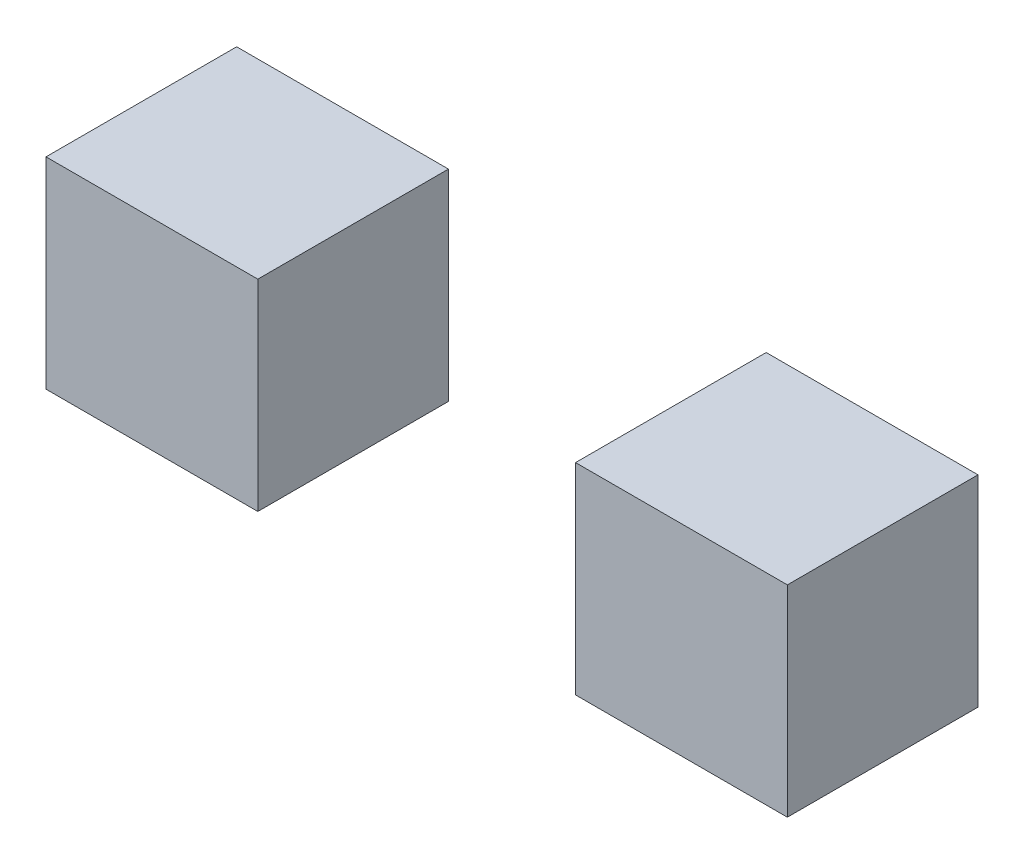
ISO-10303-21;
HEADER;
FILE_DESCRIPTION(('STEP AP214'),'2;1');
FILE_NAME('part.step','',(''),(''),'','','');
FILE_SCHEMA(('AUTOMOTIVE_DESIGN { 1 0 10303 214 1 1 1 1 }'));
ENDSEC;
DATA;
#1=APPLICATION_CONTEXT('core data for automotive mechanical design processes');
#2=APPLICATION_PROTOCOL_DEFINITION('international standard','automotive_design',2000,#1);
#3=PRODUCT_CONTEXT('',#1,'mechanical');
#4=PRODUCT('Part','Part','',(#3));
#5=PRODUCT_RELATED_PRODUCT_CATEGORY('part','',(#4));
#6=PRODUCT_DEFINITION_FORMATION('','',#4);
#7=PRODUCT_DEFINITION_CONTEXT('part definition',#1,'design');
#8=PRODUCT_DEFINITION('design','',#6,#7);
#9=PRODUCT_DEFINITION_SHAPE('','',#8);
#10=(LENGTH_UNIT() NAMED_UNIT(*) SI_UNIT(.MILLI.,.METRE.));
#11=(NAMED_UNIT(*) PLANE_ANGLE_UNIT() SI_UNIT($,.RADIAN.));
#12=(NAMED_UNIT(*) SI_UNIT($,.STERADIAN.) SOLID_ANGLE_UNIT());
#13=UNCERTAINTY_MEASURE_WITH_UNIT(LENGTH_MEASURE(1.E-05),#10,'distance_accuracy_value','');
#14=(GEOMETRIC_REPRESENTATION_CONTEXT(3) GLOBAL_UNCERTAINTY_ASSIGNED_CONTEXT((#13)) GLOBAL_UNIT_ASSIGNED_CONTEXT((#10,
#11,#12)) REPRESENTATION_CONTEXT('',''));
#15=CARTESIAN_POINT('',(0.,0.,0.));
#16=DIRECTION('',(0.,0.,1.));
#17=DIRECTION('',(1.,0.,0.));
#18=AXIS2_PLACEMENT_3D('',#15,#16,#17);
#19=CARTESIAN_POINT('',(0.,0.,9.));
#20=DIRECTION('',(0.,0.,-1.));
#21=DIRECTION('',(-1.,0.,0.));
#22=AXIS2_PLACEMENT_3D('',#19,#20,#21);
#23=PLANE('',#22);
#24=DIRECTION('',(-1.,0.,0.));
#25=VECTOR('',#24,1.);
#26=CARTESIAN_POINT('',(4.75,4.75,9.));
#27=LINE('',#26,#25);
#28=CARTESIAN_POINT('',(20.25,4.75,9.));
#29=VERTEX_POINT('',#28);
#30=CARTESIAN_POINT('',(10.25,4.75000000000001,9.));
#31=VERTEX_POINT('',#30);
#32=EDGE_CURVE('E83',#29,#31,#27,.T.);
#33=ORIENTED_EDGE('',*,*,#32,.T.);
#34=DIRECTION('',(0.,1.,0.));
#35=VECTOR('',#34,1.);
#36=CARTESIAN_POINT('',(10.25,22.115736842558,9.));
#37=LINE('',#36,#35);
#38=CARTESIAN_POINT('',(10.25,-4.74999999999999,9.));
#39=VERTEX_POINT('',#38);
#40=EDGE_CURVE('E53',#39,#31,#37,.T.);
#41=ORIENTED_EDGE('',*,*,#40,.F.);
#42=DIRECTION('',(1.,0.,0.));
#43=VECTOR('',#42,1.);
#44=CARTESIAN_POINT('',(4.75,-4.75,9.));
#45=LINE('',#44,#43);
#46=CARTESIAN_POINT('',(20.25,-4.75,9.));
#47=VERTEX_POINT('',#46);
#48=EDGE_CURVE('E92',#39,#47,#45,.T.);
#49=ORIENTED_EDGE('',*,*,#48,.T.);
#50=DIRECTION('',(0.,1.,0.));
#51=VECTOR('',#50,1.);
#52=CARTESIAN_POINT('',(20.25,-4.75,9.));
#53=LINE('',#52,#51);
#54=EDGE_CURVE('E115',#47,#29,#53,.T.);
#55=ORIENTED_EDGE('',*,*,#54,.T.);
#56=EDGE_LOOP('',(#33,#41,#49,#55));
#57=FACE_BOUND('',#56,.T.);
#58=ADVANCED_FACE('F49',(#57),#23,.F.);
#59=CARTESIAN_POINT('',(0.,0.,0.));
#60=DIRECTION('',(0.,0.,-1.));
#61=DIRECTION('',(-1.,0.,0.));
#62=AXIS2_PLACEMENT_3D('',#59,#60,#61);
#63=PLANE('',#62);
#64=DIRECTION('',(0.,-1.,0.));
#65=VECTOR('',#64,1.);
#66=CARTESIAN_POINT('',(10.25,0.,0.));
#67=LINE('',#66,#65);
#68=CARTESIAN_POINT('',(10.25,4.75,0.));
#69=VERTEX_POINT('',#68);
#70=CARTESIAN_POINT('',(10.25,-4.74999999999999,0.));
#71=VERTEX_POINT('',#70);
#72=EDGE_CURVE('E12',#69,#71,#67,.T.);
#73=ORIENTED_EDGE('',*,*,#72,.F.);
#74=DIRECTION('',(-1.,0.,0.));
#75=VECTOR('',#74,1.);
#76=CARTESIAN_POINT('',(4.75,4.75,0.));
#77=LINE('',#76,#75);
#78=CARTESIAN_POINT('',(20.25,4.75,0.));
#79=VERTEX_POINT('',#78);
#80=EDGE_CURVE('E98',#79,#69,#77,.T.);
#81=ORIENTED_EDGE('',*,*,#80,.F.);
#82=DIRECTION('',(0.,1.,0.));
#83=VECTOR('',#82,1.);
#84=CARTESIAN_POINT('',(20.25,-4.75,0.));
#85=LINE('',#84,#83);
#86=CARTESIAN_POINT('',(20.25,-4.75,0.));
#87=VERTEX_POINT('',#86);
#88=EDGE_CURVE('E101',#87,#79,#85,.T.);
#89=ORIENTED_EDGE('',*,*,#88,.F.);
#90=DIRECTION('',(1.,0.,0.));
#91=VECTOR('',#90,1.);
#92=CARTESIAN_POINT('',(4.75,-4.75,0.));
#93=LINE('',#92,#91);
#94=EDGE_CURVE('E117',#71,#87,#93,.T.);
#95=ORIENTED_EDGE('',*,*,#94,.F.);
#96=EDGE_LOOP('',(#73,#81,#89,#95));
#97=FACE_BOUND('',#96,.T.);
#98=ADVANCED_FACE('F51',(#97),#63,.T.);
#99=CARTESIAN_POINT('',(4.75,-4.75,9.));
#100=DIRECTION('',(0.,1.,0.));
#101=DIRECTION('',(0.,0.,1.));
#102=AXIS2_PLACEMENT_3D('',#99,#100,#101);
#103=PLANE('',#102);
#104=ORIENTED_EDGE('',*,*,#48,.F.);
#105=DIRECTION('',(0.,0.,-1.));
#106=VECTOR('',#105,1.);
#107=CARTESIAN_POINT('',(10.25,-4.75,9.));
#108=LINE('',#107,#106);
#109=EDGE_CURVE('E64',#39,#71,#108,.T.);
#110=ORIENTED_EDGE('',*,*,#109,.T.);
#111=ORIENTED_EDGE('',*,*,#94,.T.);
#112=DIRECTION('',(0.,0.,1.));
#113=VECTOR('',#112,1.);
#114=CARTESIAN_POINT('',(20.25,-4.75,0.));
#115=LINE('',#114,#113);
#116=EDGE_CURVE('E103',#87,#47,#115,.T.);
#117=ORIENTED_EDGE('',*,*,#116,.T.);
#118=EDGE_LOOP('',(#104,#110,#111,#117));
#119=FACE_BOUND('',#118,.T.);
#120=ADVANCED_FACE('F122',(#119),#103,.F.);
#121=CARTESIAN_POINT('',(4.75,4.75,9.));
#122=DIRECTION('',(0.,-1.,0.));
#123=DIRECTION('',(1.,0.,0.));
#124=AXIS2_PLACEMENT_3D('',#121,#122,#123);
#125=PLANE('',#124);
#126=ORIENTED_EDGE('',*,*,#80,.T.);
#127=DIRECTION('',(0.,0.,1.));
#128=VECTOR('',#127,1.);
#129=CARTESIAN_POINT('',(10.25,4.75,9.));
#130=LINE('',#129,#128);
#131=EDGE_CURVE('E102',#69,#31,#130,.T.);
#132=ORIENTED_EDGE('',*,*,#131,.T.);
#133=ORIENTED_EDGE('',*,*,#32,.F.);
#134=DIRECTION('',(0.,0.,1.));
#135=VECTOR('',#134,1.);
#136=CARTESIAN_POINT('',(20.25,4.75,0.));
#137=LINE('',#136,#135);
#138=EDGE_CURVE('E105',#79,#29,#137,.T.);
#139=ORIENTED_EDGE('',*,*,#138,.F.);
#140=EDGE_LOOP('',(#126,#132,#133,#139));
#141=FACE_BOUND('',#140,.T.);
#142=ADVANCED_FACE('F106',(#141),#125,.F.);
#143=CARTESIAN_POINT('',(20.25,-4.75,0.));
#144=DIRECTION('',(1.,0.,0.));
#145=DIRECTION('',(0.,0.,-1.));
#146=AXIS2_PLACEMENT_3D('',#143,#144,#145);
#147=PLANE('',#146);
#148=ORIENTED_EDGE('',*,*,#54,.F.);
#149=ORIENTED_EDGE('',*,*,#116,.F.);
#150=ORIENTED_EDGE('',*,*,#88,.T.);
#151=ORIENTED_EDGE('',*,*,#138,.T.);
#152=EDGE_LOOP('',(#148,#149,#150,#151));
#153=FACE_BOUND('',#152,.T.);
#154=ADVANCED_FACE('F111',(#153),#147,.T.);
#155=CARTESIAN_POINT('',(10.25,22.115736842558,0.));
#156=DIRECTION('',(1.,0.,0.));
#157=DIRECTION('',(0.,0.,-1.));
#158=AXIS2_PLACEMENT_3D('',#155,#156,#157);
#159=PLANE('',#158);
#160=ORIENTED_EDGE('',*,*,#40,.T.);
#161=ORIENTED_EDGE('',*,*,#131,.F.);
#162=ORIENTED_EDGE('',*,*,#72,.T.);
#163=ORIENTED_EDGE('',*,*,#109,.F.);
#164=EDGE_LOOP('',(#160,#161,#162,#163));
#165=FACE_BOUND('',#164,.T.);
#166=ADVANCED_FACE('F134',(#165),#159,.F.);
#167=CLOSED_SHELL('',(#58,#98,#120,#142,#154,#166));
#168=MANIFOLD_SOLID_BREP('B2',#167);
#169=CARTESIAN_POINT('',(-14.75,-4.75,9.));
#170=DIRECTION('',(1.,0.,0.));
#171=DIRECTION('',(0.,0.,-1.));
#172=AXIS2_PLACEMENT_3D('',#169,#170,#171);
#173=PLANE('',#172);
#174=DIRECTION('',(0.,-1.,0.));
#175=VECTOR('',#174,1.);
#176=CARTESIAN_POINT('',(-14.75,-4.75,0.));
#177=LINE('',#176,#175);
#178=CARTESIAN_POINT('',(-14.75,4.75,0.));
#179=VERTEX_POINT('',#178);
#180=CARTESIAN_POINT('',(-14.75,-4.75,0.));
#181=VERTEX_POINT('',#180);
#182=EDGE_CURVE('E216',#179,#181,#177,.T.);
#183=ORIENTED_EDGE('',*,*,#182,.T.);
#184=DIRECTION('',(0.,0.,-1.));
#185=VECTOR('',#184,1.);
#186=CARTESIAN_POINT('',(-14.75,-4.75,9.));
#187=LINE('',#186,#185);
#188=CARTESIAN_POINT('',(-14.75,-4.75,9.));
#189=VERTEX_POINT('',#188);
#190=EDGE_CURVE('E234',#189,#181,#187,.T.);
#191=ORIENTED_EDGE('',*,*,#190,.F.);
#192=DIRECTION('',(0.,-1.,0.));
#193=VECTOR('',#192,1.);
#194=CARTESIAN_POINT('',(-14.75,-4.75,9.));
#195=LINE('',#194,#193);
#196=CARTESIAN_POINT('',(-14.75,4.75,9.));
#197=VERTEX_POINT('',#196);
#198=EDGE_CURVE('E203',#197,#189,#195,.T.);
#199=ORIENTED_EDGE('',*,*,#198,.F.);
#200=DIRECTION('',(0.,0.,-1.));
#201=VECTOR('',#200,1.);
#202=CARTESIAN_POINT('',(-14.75,4.75,9.));
#203=LINE('',#202,#201);
#204=EDGE_CURVE('E255',#197,#179,#203,.T.);
#205=ORIENTED_EDGE('',*,*,#204,.T.);
#206=EDGE_LOOP('',(#183,#191,#199,#205));
#207=FACE_BOUND('',#206,.T.);
#208=ADVANCED_FACE('F185',(#207),#173,.F.);
#209=CARTESIAN_POINT('',(0.,0.,9.));
#210=DIRECTION('',(0.,0.,-1.));
#211=DIRECTION('',(-1.,0.,0.));
#212=AXIS2_PLACEMENT_3D('',#209,#210,#211);
#213=PLANE('',#212);
#214=DIRECTION('',(1.,0.,0.));
#215=VECTOR('',#214,1.);
#216=CARTESIAN_POINT('',(-14.75,-4.75,9.));
#217=LINE('',#216,#215);
#218=CARTESIAN_POINT('',(-4.75,-4.74999999999999,9.));
#219=VERTEX_POINT('',#218);
#220=EDGE_CURVE('E235',#189,#219,#217,.T.);
#221=ORIENTED_EDGE('',*,*,#220,.T.);
#222=DIRECTION('',(0.,-1.,0.));
#223=VECTOR('',#222,1.);
#224=CARTESIAN_POINT('',(-4.75,22.115736842558,9.));
#225=LINE('',#224,#223);
#226=CARTESIAN_POINT('',(-4.75,4.75000000000001,9.));
#227=VERTEX_POINT('',#226);
#228=EDGE_CURVE('E229',#227,#219,#225,.T.);
#229=ORIENTED_EDGE('',*,*,#228,.F.);
#230=DIRECTION('',(-1.,0.,0.));
#231=VECTOR('',#230,1.);
#232=CARTESIAN_POINT('',(-14.75,4.75,9.));
#233=LINE('',#232,#231);
#234=EDGE_CURVE('E245',#227,#197,#233,.T.);
#235=ORIENTED_EDGE('',*,*,#234,.T.);
#236=ORIENTED_EDGE('',*,*,#198,.T.);
#237=EDGE_LOOP('',(#221,#229,#235,#236));
#238=FACE_BOUND('',#237,.T.);
#239=ADVANCED_FACE('F263',(#238),#213,.F.);
#240=CARTESIAN_POINT('',(0.,0.,0.));
#241=DIRECTION('',(0.,0.,-1.));
#242=DIRECTION('',(-1.,0.,0.));
#243=AXIS2_PLACEMENT_3D('',#240,#241,#242);
#244=PLANE('',#243);
#245=DIRECTION('',(0.,1.,0.));
#246=VECTOR('',#245,1.);
#247=CARTESIAN_POINT('',(-4.75,0.,0.));
#248=LINE('',#247,#246);
#249=CARTESIAN_POINT('',(-4.75,-4.75,0.));
#250=VERTEX_POINT('',#249);
#251=CARTESIAN_POINT('',(-4.75,4.75000000000001,0.));
#252=VERTEX_POINT('',#251);
#253=EDGE_CURVE('E47',#250,#252,#248,.T.);
#254=ORIENTED_EDGE('',*,*,#253,.F.);
#255=DIRECTION('',(1.,0.,0.));
#256=VECTOR('',#255,1.);
#257=CARTESIAN_POINT('',(-14.75,-4.75,0.));
#258=LINE('',#257,#256);
#259=EDGE_CURVE('E241',#181,#250,#258,.T.);
#260=ORIENTED_EDGE('',*,*,#259,.F.);
#261=ORIENTED_EDGE('',*,*,#182,.F.);
#262=DIRECTION('',(-1.,0.,0.));
#263=VECTOR('',#262,1.);
#264=CARTESIAN_POINT('',(-14.75,4.75,0.));
#265=LINE('',#264,#263);
#266=EDGE_CURVE('E242',#252,#179,#265,.T.);
#267=ORIENTED_EDGE('',*,*,#266,.F.);
#268=EDGE_LOOP('',(#254,#260,#261,#267));
#269=FACE_BOUND('',#268,.T.);
#270=ADVANCED_FACE('F240',(#269),#244,.T.);
#271=CARTESIAN_POINT('',(-14.75,-4.75,9.));
#272=DIRECTION('',(0.,1.,0.));
#273=DIRECTION('',(-1.,0.,0.));
#274=AXIS2_PLACEMENT_3D('',#271,#272,#273);
#275=PLANE('',#274);
#276=ORIENTED_EDGE('',*,*,#259,.T.);
#277=DIRECTION('',(0.,0.,-1.));
#278=VECTOR('',#277,1.);
#279=CARTESIAN_POINT('',(-4.75,-4.75,9.));
#280=LINE('',#279,#278);
#281=EDGE_CURVE('E222',#219,#250,#280,.T.);
#282=ORIENTED_EDGE('',*,*,#281,.F.);
#283=ORIENTED_EDGE('',*,*,#220,.F.);
#284=ORIENTED_EDGE('',*,*,#190,.T.);
#285=EDGE_LOOP('',(#276,#282,#283,#284));
#286=FACE_BOUND('',#285,.T.);
#287=ADVANCED_FACE('F243',(#286),#275,.F.);
#288=CARTESIAN_POINT('',(-14.75,4.75,9.));
#289=DIRECTION('',(0.,-1.,0.));
#290=DIRECTION('',(1.,0.,0.));
#291=AXIS2_PLACEMENT_3D('',#288,#289,#290);
#292=PLANE('',#291);
#293=ORIENTED_EDGE('',*,*,#266,.T.);
#294=ORIENTED_EDGE('',*,*,#204,.F.);
#295=ORIENTED_EDGE('',*,*,#234,.F.);
#296=DIRECTION('',(0.,0.,-1.));
#297=VECTOR('',#296,1.);
#298=CARTESIAN_POINT('',(-4.75,4.75,9.));
#299=LINE('',#298,#297);
#300=EDGE_CURVE('E195',#227,#252,#299,.T.);
#301=ORIENTED_EDGE('',*,*,#300,.T.);
#302=EDGE_LOOP('',(#293,#294,#295,#301));
#303=FACE_BOUND('',#302,.T.);
#304=ADVANCED_FACE('F187',(#303),#292,.F.);
#305=CARTESIAN_POINT('',(-4.75,22.115736842558,0.));
#306=DIRECTION('',(-1.,0.,0.));
#307=DIRECTION('',(0.,0.,1.));
#308=AXIS2_PLACEMENT_3D('',#305,#306,#307);
#309=PLANE('',#308);
#310=ORIENTED_EDGE('',*,*,#228,.T.);
#311=ORIENTED_EDGE('',*,*,#281,.T.);
#312=ORIENTED_EDGE('',*,*,#253,.T.);
#313=ORIENTED_EDGE('',*,*,#300,.F.);
#314=EDGE_LOOP('',(#310,#311,#312,#313));
#315=FACE_BOUND('',#314,.T.);
#316=ADVANCED_FACE('F224',(#315),#309,.F.);
#317=CLOSED_SHELL('',(#208,#239,#270,#287,#304,#316));
#318=MANIFOLD_SOLID_BREP('B6',#317);
#319=ADVANCED_BREP_SHAPE_REPRESENTATION('',(#18,#168,#318),#14);
#320=SHAPE_DEFINITION_REPRESENTATION(#9,#319);
ENDSEC;
END-ISO-10303-21;
